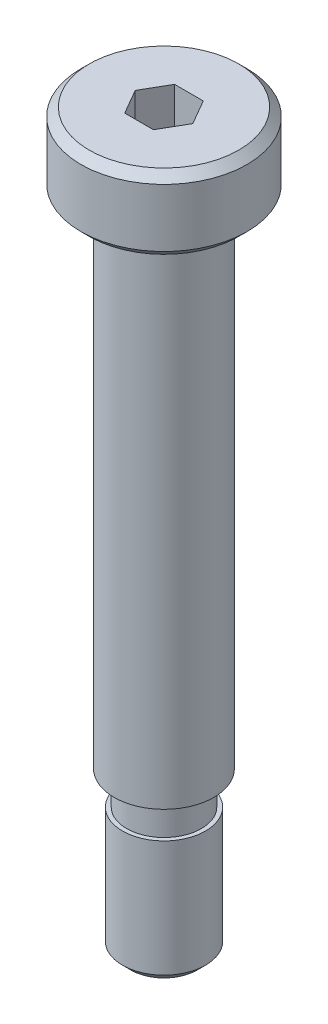
ISO-10303-21;
HEADER;
FILE_DESCRIPTION(('STEP AP214'),'2;1');
FILE_NAME('part.step','',(''),(''),'','','');
FILE_SCHEMA(('AUTOMOTIVE_DESIGN { 1 0 10303 214 1 1 1 1 }'));
ENDSEC;
DATA;
#1=APPLICATION_CONTEXT('core data for automotive mechanical design processes');
#2=APPLICATION_PROTOCOL_DEFINITION('international standard','automotive_design',2000,#1);
#3=PRODUCT_CONTEXT('',#1,'mechanical');
#4=PRODUCT('Part','Part','',(#3));
#5=PRODUCT_RELATED_PRODUCT_CATEGORY('part','',(#4));
#6=PRODUCT_DEFINITION_FORMATION('','',#4);
#7=PRODUCT_DEFINITION_CONTEXT('part definition',#1,'design');
#8=PRODUCT_DEFINITION('design','',#6,#7);
#9=PRODUCT_DEFINITION_SHAPE('','',#8);
#10=(LENGTH_UNIT() NAMED_UNIT(*) SI_UNIT(.MILLI.,.METRE.));
#11=(NAMED_UNIT(*) PLANE_ANGLE_UNIT() SI_UNIT($,.RADIAN.));
#12=(NAMED_UNIT(*) SI_UNIT($,.STERADIAN.) SOLID_ANGLE_UNIT());
#13=UNCERTAINTY_MEASURE_WITH_UNIT(LENGTH_MEASURE(1.E-05),#10,'distance_accuracy_value','');
#14=(GEOMETRIC_REPRESENTATION_CONTEXT(3) GLOBAL_UNCERTAINTY_ASSIGNED_CONTEXT((#13)) GLOBAL_UNIT_ASSIGNED_CONTEXT((#10,
#11,#12)) REPRESENTATION_CONTEXT('',''));
#15=CARTESIAN_POINT('',(0.,0.,0.));
#16=DIRECTION('',(0.,0.,1.));
#17=DIRECTION('',(1.,0.,0.));
#18=AXIS2_PLACEMENT_3D('',#15,#16,#17);
#19=CARTESIAN_POINT('',(0.,0.,0.));
#20=DIRECTION('',(0.,-1.,0.));
#21=DIRECTION('',(1.,0.,0.));
#22=AXIS2_PLACEMENT_3D('',#19,#20,#21);
#23=PLANE('',#22);
#24=DIRECTION('',(-0.5,0.,-0.866025403784438));
#25=VECTOR('',#24,1.);
#26=CARTESIAN_POINT('',(1.73205080756888,0.,0.));
#27=LINE('',#26,#25);
#28=CARTESIAN_POINT('',(1.73205080756888,0.,0.));
#29=VERTEX_POINT('',#28);
#30=CARTESIAN_POINT('',(0.866025403784439,0.,-1.5));
#31=VERTEX_POINT('',#30);
#32=EDGE_CURVE('E140',#29,#31,#27,.T.);
#33=ORIENTED_EDGE('',*,*,#32,.F.);
#34=DIRECTION('',(0.5,0.,-0.866025403784439));
#35=VECTOR('',#34,1.);
#36=CARTESIAN_POINT('',(0.866025403784439,0.,1.5));
#37=LINE('',#36,#35);
#38=CARTESIAN_POINT('',(0.866025403784439,0.,1.5));
#39=VERTEX_POINT('',#38);
#40=EDGE_CURVE('E66',#39,#29,#37,.T.);
#41=ORIENTED_EDGE('',*,*,#40,.F.);
#42=DIRECTION('',(1.,0.,0.));
#43=VECTOR('',#42,1.);
#44=CARTESIAN_POINT('',(-0.866025403784439,0.,1.5));
#45=LINE('',#44,#43);
#46=CARTESIAN_POINT('',(-0.866025403784439,0.,1.5));
#47=VERTEX_POINT('',#46);
#48=EDGE_CURVE('E149',#47,#39,#45,.T.);
#49=ORIENTED_EDGE('',*,*,#48,.F.);
#50=DIRECTION('',(0.5,0.,0.866025403784439));
#51=VECTOR('',#50,1.);
#52=CARTESIAN_POINT('',(-1.73205080756888,0.,0.));
#53=LINE('',#52,#51);
#54=CARTESIAN_POINT('',(-1.73205080756888,0.,0.));
#55=VERTEX_POINT('',#54);
#56=EDGE_CURVE('E147',#55,#47,#53,.T.);
#57=ORIENTED_EDGE('',*,*,#56,.F.);
#58=DIRECTION('',(-0.5,0.,0.866025403784439));
#59=VECTOR('',#58,1.);
#60=CARTESIAN_POINT('',(-0.86602540378444,0.,-1.5));
#61=LINE('',#60,#59);
#62=CARTESIAN_POINT('',(-0.86602540378444,0.,-1.5));
#63=VERTEX_POINT('',#62);
#64=EDGE_CURVE('E114',#63,#55,#61,.T.);
#65=ORIENTED_EDGE('',*,*,#64,.F.);
#66=DIRECTION('',(-1.,0.,0.));
#67=VECTOR('',#66,1.);
#68=CARTESIAN_POINT('',(0.866025403784439,0.,-1.5));
#69=LINE('',#68,#67);
#70=EDGE_CURVE('E143',#31,#63,#69,.T.);
#71=ORIENTED_EDGE('',*,*,#70,.F.);
#72=EDGE_LOOP('',(#33,#41,#49,#57,#65,#71));
#73=FACE_BOUND('',#72,.T.);
#74=CARTESIAN_POINT('',(0.,0.,0.));
#75=DIRECTION('',(0.,-1.,0.));
#76=DIRECTION('',(1.,0.,0.));
#77=AXIS2_PLACEMENT_3D('',#74,#75,#76);
#78=CIRCLE('',#77,4.5);
#79=CARTESIAN_POINT('',(4.5,0.,0.));
#80=VERTEX_POINT('',#79);
#81=EDGE_CURVE('E11',#80,#80,#78,.F.);
#82=ORIENTED_EDGE('',*,*,#81,.T.);
#83=EDGE_LOOP('',(#82));
#84=FACE_BOUND('',#83,.T.);
#85=ADVANCED_FACE('F50',(#73,#84),#23,.F.);
#86=CARTESIAN_POINT('',(0.,3.,0.));
#87=DIRECTION('',(0.,1.,0.));
#88=DIRECTION('',(-1.,0.,0.));
#89=AXIS2_PLACEMENT_3D('',#86,#87,#88);
#90=CYLINDRICAL_SURFACE('',#89,5.);
#91=CARTESIAN_POINT('',(0.,-4.00000000000001,0.));
#92=DIRECTION('',(0.,1.,0.));
#93=DIRECTION('',(-1.,0.,0.));
#94=AXIS2_PLACEMENT_3D('',#91,#92,#93);
#95=CIRCLE('',#94,5.);
#96=CARTESIAN_POINT('',(-5.,-4.00000000000001,0.));
#97=VERTEX_POINT('',#96);
#98=EDGE_CURVE('E188',#97,#97,#95,.T.);
#99=ORIENTED_EDGE('',*,*,#98,.T.);
#100=EDGE_LOOP('',(#99));
#101=FACE_BOUND('',#100,.T.);
#102=CARTESIAN_POINT('',(0.,-0.500000000000008,0.));
#103=DIRECTION('',(0.,-1.,0.));
#104=DIRECTION('',(1.,0.,0.));
#105=AXIS2_PLACEMENT_3D('',#102,#103,#104);
#106=CIRCLE('',#105,5.);
#107=CARTESIAN_POINT('',(5.,-0.500000000000007,0.));
#108=VERTEX_POINT('',#107);
#109=EDGE_CURVE('E185',#108,#108,#106,.T.);
#110=ORIENTED_EDGE('',*,*,#109,.T.);
#111=EDGE_LOOP('',(#110));
#112=FACE_BOUND('',#111,.T.);
#113=ADVANCED_FACE('F202',(#101,#112),#90,.T.);
#114=CARTESIAN_POINT('',(5.,-4.5,0.));
#115=DIRECTION('',(0.,1.,0.));
#116=DIRECTION('',(-1.,0.,0.));
#117=AXIS2_PLACEMENT_3D('',#114,#115,#116);
#118=PLANE('',#117);
#119=CARTESIAN_POINT('',(0.,-4.5,0.));
#120=DIRECTION('',(0.,1.,0.));
#121=DIRECTION('',(-1.,0.,0.));
#122=AXIS2_PLACEMENT_3D('',#119,#120,#121);
#123=CIRCLE('',#122,4.50000000000001);
#124=CARTESIAN_POINT('',(-4.50000000000001,-4.5,0.));
#125=VERTEX_POINT('',#124);
#126=EDGE_CURVE('E59',#125,#125,#123,.F.);
#127=ORIENTED_EDGE('',*,*,#126,.T.);
#128=EDGE_LOOP('',(#127));
#129=FACE_BOUND('',#128,.T.);
#130=CARTESIAN_POINT('',(0.,-4.5,0.));
#131=DIRECTION('',(0.,1.,0.));
#132=DIRECTION('',(-1.,0.,0.));
#133=AXIS2_PLACEMENT_3D('',#130,#131,#132);
#134=CIRCLE('',#133,2.75);
#135=CARTESIAN_POINT('',(-2.75,-4.5,0.));
#136=VERTEX_POINT('',#135);
#137=EDGE_CURVE('E176',#136,#136,#134,.T.);
#138=ORIENTED_EDGE('',*,*,#137,.T.);
#139=EDGE_LOOP('',(#138));
#140=FACE_BOUND('',#139,.T.);
#141=ADVANCED_FACE('F193',(#129,#140),#118,.F.);
#142=CARTESIAN_POINT('',(0.,3.,0.));
#143=DIRECTION('',(0.,1.,0.));
#144=DIRECTION('',(-1.,0.,0.));
#145=AXIS2_PLACEMENT_3D('',#142,#143,#144);
#146=CYLINDRICAL_SURFACE('',#145,2.75);
#147=ORIENTED_EDGE('',*,*,#137,.F.);
#148=EDGE_LOOP('',(#147));
#149=FACE_BOUND('',#148,.T.);
#150=CARTESIAN_POINT('',(0.,-5.,0.));
#151=DIRECTION('',(0.,1.,0.));
#152=DIRECTION('',(-1.,0.,0.));
#153=AXIS2_PLACEMENT_3D('',#150,#151,#152);
#154=CIRCLE('',#153,2.75);
#155=CARTESIAN_POINT('',(-2.75,-5.,0.));
#156=VERTEX_POINT('',#155);
#157=EDGE_CURVE('E173',#156,#156,#154,.T.);
#158=ORIENTED_EDGE('',*,*,#157,.T.);
#159=EDGE_LOOP('',(#158));
#160=FACE_BOUND('',#159,.T.);
#161=ADVANCED_FACE('F273',(#149,#160),#146,.T.);
#162=CARTESIAN_POINT('',(2.75,-5.,0.));
#163=DIRECTION('',(0.,-1.,0.));
#164=DIRECTION('',(1.,0.,0.));
#165=AXIS2_PLACEMENT_3D('',#162,#163,#164);
#166=PLANE('',#165);
#167=ORIENTED_EDGE('',*,*,#157,.F.);
#168=EDGE_LOOP('',(#167));
#169=FACE_BOUND('',#168,.T.);
#170=CARTESIAN_POINT('',(0.,-5.,0.));
#171=DIRECTION('',(0.,1.,0.));
#172=DIRECTION('',(-1.,0.,0.));
#173=AXIS2_PLACEMENT_3D('',#170,#171,#172);
#174=CIRCLE('',#173,3.);
#175=CARTESIAN_POINT('',(-3.,-5.,0.));
#176=VERTEX_POINT('',#175);
#177=EDGE_CURVE('E170',#176,#176,#174,.T.);
#178=ORIENTED_EDGE('',*,*,#177,.T.);
#179=EDGE_LOOP('',(#178));
#180=FACE_BOUND('',#179,.T.);
#181=ADVANCED_FACE('F269',(#169,#180),#166,.F.);
#182=CARTESIAN_POINT('',(0.,3.,0.));
#183=DIRECTION('',(0.,1.,0.));
#184=DIRECTION('',(-1.,0.,0.));
#185=AXIS2_PLACEMENT_3D('',#182,#183,#184);
#186=CYLINDRICAL_SURFACE('',#185,3.);
#187=ORIENTED_EDGE('',*,*,#177,.F.);
#188=EDGE_LOOP('',(#187));
#189=FACE_BOUND('',#188,.T.);
#190=CARTESIAN_POINT('',(0.,-34.5,0.));
#191=DIRECTION('',(0.,1.,0.));
#192=DIRECTION('',(-1.,0.,0.));
#193=AXIS2_PLACEMENT_3D('',#190,#191,#192);
#194=CIRCLE('',#193,3.00000000000001);
#195=CARTESIAN_POINT('',(-3.,-34.5,0.));
#196=VERTEX_POINT('',#195);
#197=EDGE_CURVE('E167',#196,#196,#194,.T.);
#198=ORIENTED_EDGE('',*,*,#197,.T.);
#199=EDGE_LOOP('',(#198));
#200=FACE_BOUND('',#199,.T.);
#201=ADVANCED_FACE('F265',(#189,#200),#186,.T.);
#202=CARTESIAN_POINT('',(3.00000000000001,-34.5,0.));
#203=DIRECTION('',(0.,1.,0.));
#204=DIRECTION('',(-1.,0.,0.));
#205=AXIS2_PLACEMENT_3D('',#202,#203,#204);
#206=PLANE('',#205);
#207=ORIENTED_EDGE('',*,*,#197,.F.);
#208=EDGE_LOOP('',(#207));
#209=FACE_BOUND('',#208,.T.);
#210=CARTESIAN_POINT('',(0.,-34.5,0.));
#211=DIRECTION('',(0.,1.,0.));
#212=DIRECTION('',(-1.,0.,0.));
#213=AXIS2_PLACEMENT_3D('',#210,#211,#212);
#214=CIRCLE('',#213,2.25);
#215=CARTESIAN_POINT('',(-2.25,-34.5,0.));
#216=VERTEX_POINT('',#215);
#217=EDGE_CURVE('E164',#216,#216,#214,.T.);
#218=ORIENTED_EDGE('',*,*,#217,.T.);
#219=EDGE_LOOP('',(#218));
#220=FACE_BOUND('',#219,.T.);
#221=ADVANCED_FACE('F258',(#209,#220),#206,.F.);
#222=CARTESIAN_POINT('',(0.,3.,0.));
#223=DIRECTION('',(0.,1.,0.));
#224=DIRECTION('',(-1.,0.,0.));
#225=AXIS2_PLACEMENT_3D('',#222,#223,#224);
#226=CYLINDRICAL_SURFACE('',#225,2.25);
#227=ORIENTED_EDGE('',*,*,#217,.F.);
#228=EDGE_LOOP('',(#227));
#229=FACE_BOUND('',#228,.T.);
#230=CARTESIAN_POINT('',(0.,-36.5,0.));
#231=DIRECTION('',(0.,1.,0.));
#232=DIRECTION('',(-1.,0.,0.));
#233=AXIS2_PLACEMENT_3D('',#230,#231,#232);
#234=CIRCLE('',#233,2.25);
#235=CARTESIAN_POINT('',(-2.25,-36.5,0.));
#236=VERTEX_POINT('',#235);
#237=EDGE_CURVE('E161',#236,#236,#234,.T.);
#238=ORIENTED_EDGE('',*,*,#237,.T.);
#239=EDGE_LOOP('',(#238));
#240=FACE_BOUND('',#239,.T.);
#241=ADVANCED_FACE('F252',(#229,#240),#226,.T.);
#242=CARTESIAN_POINT('',(2.5,-36.5,0.));
#243=DIRECTION('',(0.,-1.,0.));
#244=DIRECTION('',(1.,0.,0.));
#245=AXIS2_PLACEMENT_3D('',#242,#243,#244);
#246=PLANE('',#245);
#247=ORIENTED_EDGE('',*,*,#237,.F.);
#248=EDGE_LOOP('',(#247));
#249=FACE_BOUND('',#248,.T.);
#250=CARTESIAN_POINT('',(0.,-36.5,0.));
#251=DIRECTION('',(0.,1.,0.));
#252=DIRECTION('',(-1.,0.,0.));
#253=AXIS2_PLACEMENT_3D('',#250,#251,#252);
#254=CIRCLE('',#253,2.5);
#255=CARTESIAN_POINT('',(-2.5,-36.5,0.));
#256=VERTEX_POINT('',#255);
#257=EDGE_CURVE('E153',#256,#256,#254,.T.);
#258=ORIENTED_EDGE('',*,*,#257,.T.);
#259=EDGE_LOOP('',(#258));
#260=FACE_BOUND('',#259,.T.);
#261=ADVANCED_FACE('F247',(#249,#260),#246,.F.);
#262=CARTESIAN_POINT('',(0.,3.,0.));
#263=DIRECTION('',(0.,1.,0.));
#264=DIRECTION('',(-1.,0.,0.));
#265=AXIS2_PLACEMENT_3D('',#262,#263,#264);
#266=CYLINDRICAL_SURFACE('',#265,2.5);
#267=CARTESIAN_POINT('',(0.,-43.5,0.));
#268=DIRECTION('',(0.,1.,0.));
#269=DIRECTION('',(-1.,0.,0.));
#270=AXIS2_PLACEMENT_3D('',#267,#268,#269);
#271=CIRCLE('',#270,2.5);
#272=CARTESIAN_POINT('',(-2.49999999999999,-43.5,0.));
#273=VERTEX_POINT('',#272);
#274=EDGE_CURVE('E179',#273,#273,#271,.T.);
#275=ORIENTED_EDGE('',*,*,#274,.T.);
#276=EDGE_LOOP('',(#275));
#277=FACE_BOUND('',#276,.T.);
#278=ORIENTED_EDGE('',*,*,#257,.F.);
#279=EDGE_LOOP('',(#278));
#280=FACE_BOUND('',#279,.T.);
#281=ADVANCED_FACE('F238',(#277,#280),#266,.T.);
#282=CARTESIAN_POINT('',(2.50000000000001,-44.,0.));
#283=DIRECTION('',(0.,1.,0.));
#284=DIRECTION('',(-1.,0.,0.));
#285=AXIS2_PLACEMENT_3D('',#282,#283,#284);
#286=PLANE('',#285);
#287=CARTESIAN_POINT('',(0.,-44.,0.));
#288=DIRECTION('',(0.,1.,0.));
#289=DIRECTION('',(-1.,0.,0.));
#290=AXIS2_PLACEMENT_3D('',#287,#288,#289);
#291=CIRCLE('',#290,1.99999999999998);
#292=CARTESIAN_POINT('',(-1.99999999999997,-44.,0.));
#293=VERTEX_POINT('',#292);
#294=EDGE_CURVE('E182',#293,#293,#291,.F.);
#295=ORIENTED_EDGE('',*,*,#294,.T.);
#296=EDGE_LOOP('',(#295));
#297=FACE_BOUND('',#296,.T.);
#298=ADVANCED_FACE('F227',(#297),#286,.F.);
#299=CARTESIAN_POINT('',(0.,-43.5,0.));
#300=DIRECTION('',(0.,1.,0.));
#301=DIRECTION('',(-1.,0.,0.));
#302=AXIS2_PLACEMENT_3D('',#299,#300,#301);
#303=CONICAL_SURFACE('',#302,2.5,0.785398163397447);
#304=ORIENTED_EDGE('',*,*,#294,.F.);
#305=EDGE_LOOP('',(#304));
#306=FACE_BOUND('',#305,.T.);
#307=ORIENTED_EDGE('',*,*,#274,.F.);
#308=EDGE_LOOP('',(#307));
#309=FACE_BOUND('',#308,.T.);
#310=ADVANCED_FACE('F199',(#306,#309),#303,.T.);
#311=CARTESIAN_POINT('',(0.,-4.00000000000001,0.));
#312=DIRECTION('',(0.,1.,0.));
#313=DIRECTION('',(-1.,0.,0.));
#314=AXIS2_PLACEMENT_3D('',#311,#312,#313);
#315=CONICAL_SURFACE('',#314,5.,0.785398163397448);
#316=ORIENTED_EDGE('',*,*,#126,.F.);
#317=EDGE_LOOP('',(#316));
#318=FACE_BOUND('',#317,.T.);
#319=ORIENTED_EDGE('',*,*,#98,.F.);
#320=EDGE_LOOP('',(#319));
#321=FACE_BOUND('',#320,.T.);
#322=ADVANCED_FACE('F196',(#318,#321),#315,.T.);
#323=CARTESIAN_POINT('',(0.,0.,0.));
#324=DIRECTION('',(0.,-1.,0.));
#325=DIRECTION('',(1.,0.,0.));
#326=AXIS2_PLACEMENT_3D('',#323,#324,#325);
#327=CONICAL_SURFACE('',#326,4.5,0.785398163397445);
#328=ORIENTED_EDGE('',*,*,#109,.F.);
#329=EDGE_LOOP('',(#328));
#330=FACE_BOUND('',#329,.T.);
#331=ORIENTED_EDGE('',*,*,#81,.F.);
#332=EDGE_LOOP('',(#331));
#333=FACE_BOUND('',#332,.T.);
#334=ADVANCED_FACE('F53',(#330,#333),#327,.T.);
#335=CARTESIAN_POINT('',(0.866025403784439,-3.,1.5));
#336=DIRECTION('',(0.866025403784439,0.,0.5));
#337=DIRECTION('',(0.5,0.,-0.866025403784439));
#338=AXIS2_PLACEMENT_3D('',#335,#336,#337);
#339=PLANE('',#338);
#340=ORIENTED_EDGE('',*,*,#40,.T.);
#341=DIRECTION('',(0.,1.,0.));
#342=VECTOR('',#341,1.);
#343=CARTESIAN_POINT('',(1.73205080756888,-3.,0.));
#344=LINE('',#343,#342);
#345=CARTESIAN_POINT('',(1.73205080756888,-3.,0.));
#346=VERTEX_POINT('',#345);
#347=EDGE_CURVE('E96',#346,#29,#344,.T.);
#348=ORIENTED_EDGE('',*,*,#347,.F.);
#349=DIRECTION('',(0.5,0.,-0.866025403784439));
#350=VECTOR('',#349,1.);
#351=CARTESIAN_POINT('',(0.866025403784439,-3.,1.5));
#352=LINE('',#351,#350);
#353=CARTESIAN_POINT('',(0.866025403784439,-3.,1.5));
#354=VERTEX_POINT('',#353);
#355=EDGE_CURVE('E151',#354,#346,#352,.T.);
#356=ORIENTED_EDGE('',*,*,#355,.F.);
#357=DIRECTION('',(0.,1.,0.));
#358=VECTOR('',#357,1.);
#359=CARTESIAN_POINT('',(0.866025403784439,-3.,1.5));
#360=LINE('',#359,#358);
#361=EDGE_CURVE('E74',#354,#39,#360,.T.);
#362=ORIENTED_EDGE('',*,*,#361,.T.);
#363=EDGE_LOOP('',(#340,#348,#356,#362));
#364=FACE_BOUND('',#363,.T.);
#365=ADVANCED_FACE('F210',(#364),#339,.F.);
#366=CARTESIAN_POINT('',(-0.866025403784439,-3.,1.5));
#367=DIRECTION('',(0.,0.,1.));
#368=DIRECTION('',(1.,0.,0.));
#369=AXIS2_PLACEMENT_3D('',#366,#367,#368);
#370=PLANE('',#369);
#371=ORIENTED_EDGE('',*,*,#48,.T.);
#372=ORIENTED_EDGE('',*,*,#361,.F.);
#373=DIRECTION('',(1.,0.,0.));
#374=VECTOR('',#373,1.);
#375=CARTESIAN_POINT('',(-0.866025403784439,-3.,1.5));
#376=LINE('',#375,#374);
#377=CARTESIAN_POINT('',(-0.866025403784439,-3.,1.5));
#378=VERTEX_POINT('',#377);
#379=EDGE_CURVE('E126',#378,#354,#376,.T.);
#380=ORIENTED_EDGE('',*,*,#379,.F.);
#381=DIRECTION('',(0.,1.,0.));
#382=VECTOR('',#381,1.);
#383=CARTESIAN_POINT('',(-0.866025403784439,-3.,1.5));
#384=LINE('',#383,#382);
#385=EDGE_CURVE('E118',#378,#47,#384,.T.);
#386=ORIENTED_EDGE('',*,*,#385,.T.);
#387=EDGE_LOOP('',(#371,#372,#380,#386));
#388=FACE_BOUND('',#387,.T.);
#389=ADVANCED_FACE('F320',(#388),#370,.F.);
#390=CARTESIAN_POINT('',(-1.73205080756888,-3.,0.));
#391=DIRECTION('',(-0.866025403784439,0.,0.5));
#392=DIRECTION('',(0.5,0.,0.866025403784439));
#393=AXIS2_PLACEMENT_3D('',#390,#391,#392);
#394=PLANE('',#393);
#395=ORIENTED_EDGE('',*,*,#56,.T.);
#396=ORIENTED_EDGE('',*,*,#385,.F.);
#397=DIRECTION('',(0.5,0.,0.866025403784439));
#398=VECTOR('',#397,1.);
#399=CARTESIAN_POINT('',(-1.73205080756888,-3.,0.));
#400=LINE('',#399,#398);
#401=CARTESIAN_POINT('',(-1.73205080756888,-3.,0.));
#402=VERTEX_POINT('',#401);
#403=EDGE_CURVE('E122',#402,#378,#400,.T.);
#404=ORIENTED_EDGE('',*,*,#403,.F.);
#405=DIRECTION('',(0.,1.,0.));
#406=VECTOR('',#405,1.);
#407=CARTESIAN_POINT('',(-1.73205080756888,-3.,0.));
#408=LINE('',#407,#406);
#409=EDGE_CURVE('E107',#402,#55,#408,.T.);
#410=ORIENTED_EDGE('',*,*,#409,.T.);
#411=EDGE_LOOP('',(#395,#396,#404,#410));
#412=FACE_BOUND('',#411,.T.);
#413=ADVANCED_FACE('F123',(#412),#394,.F.);
#414=CARTESIAN_POINT('',(-0.86602540378444,-3.,-1.5));
#415=DIRECTION('',(-0.866025403784439,0.,-0.5));
#416=DIRECTION('',(-0.5,0.,0.866025403784439));
#417=AXIS2_PLACEMENT_3D('',#414,#415,#416);
#418=PLANE('',#417);
#419=ORIENTED_EDGE('',*,*,#64,.T.);
#420=ORIENTED_EDGE('',*,*,#409,.F.);
#421=DIRECTION('',(-0.5,0.,0.866025403784439));
#422=VECTOR('',#421,1.);
#423=CARTESIAN_POINT('',(-0.86602540378444,-3.,-1.5));
#424=LINE('',#423,#422);
#425=CARTESIAN_POINT('',(-0.86602540378444,-3.,-1.5));
#426=VERTEX_POINT('',#425);
#427=EDGE_CURVE('E111',#426,#402,#424,.T.);
#428=ORIENTED_EDGE('',*,*,#427,.F.);
#429=DIRECTION('',(0.,1.,0.));
#430=VECTOR('',#429,1.);
#431=CARTESIAN_POINT('',(-0.86602540378444,-3.,-1.5));
#432=LINE('',#431,#430);
#433=EDGE_CURVE('E119',#426,#63,#432,.T.);
#434=ORIENTED_EDGE('',*,*,#433,.T.);
#435=EDGE_LOOP('',(#419,#420,#428,#434));
#436=FACE_BOUND('',#435,.T.);
#437=ADVANCED_FACE('F109',(#436),#418,.F.);
#438=CARTESIAN_POINT('',(0.866025403784439,-3.,-1.5));
#439=DIRECTION('',(0.,0.,-1.));
#440=DIRECTION('',(-1.,0.,0.));
#441=AXIS2_PLACEMENT_3D('',#438,#439,#440);
#442=PLANE('',#441);
#443=ORIENTED_EDGE('',*,*,#70,.T.);
#444=ORIENTED_EDGE('',*,*,#433,.F.);
#445=DIRECTION('',(-1.,0.,0.));
#446=VECTOR('',#445,1.);
#447=CARTESIAN_POINT('',(0.866025403784439,-3.,-1.5));
#448=LINE('',#447,#446);
#449=CARTESIAN_POINT('',(0.866025403784439,-3.,-1.5));
#450=VERTEX_POINT('',#449);
#451=EDGE_CURVE('E132',#450,#426,#448,.T.);
#452=ORIENTED_EDGE('',*,*,#451,.F.);
#453=DIRECTION('',(0.,1.,0.));
#454=VECTOR('',#453,1.);
#455=CARTESIAN_POINT('',(0.866025403784439,-3.,-1.5));
#456=LINE('',#455,#454);
#457=EDGE_CURVE('E156',#450,#31,#456,.T.);
#458=ORIENTED_EDGE('',*,*,#457,.T.);
#459=EDGE_LOOP('',(#443,#444,#452,#458));
#460=FACE_BOUND('',#459,.T.);
#461=ADVANCED_FACE('F345',(#460),#442,.F.);
#462=CARTESIAN_POINT('',(1.73205080756888,-3.,0.));
#463=DIRECTION('',(0.866025403784438,0.,-0.5));
#464=DIRECTION('',(-0.5,0.,-0.866025403784438));
#465=AXIS2_PLACEMENT_3D('',#462,#463,#464);
#466=PLANE('',#465);
#467=ORIENTED_EDGE('',*,*,#32,.T.);
#468=ORIENTED_EDGE('',*,*,#457,.F.);
#469=DIRECTION('',(-0.5,0.,-0.866025403784438));
#470=VECTOR('',#469,1.);
#471=CARTESIAN_POINT('',(1.73205080756888,-3.,0.));
#472=LINE('',#471,#470);
#473=EDGE_CURVE('E134',#346,#450,#472,.T.);
#474=ORIENTED_EDGE('',*,*,#473,.F.);
#475=ORIENTED_EDGE('',*,*,#347,.T.);
#476=EDGE_LOOP('',(#467,#468,#474,#475));
#477=FACE_BOUND('',#476,.T.);
#478=ADVANCED_FACE('F354',(#477),#466,.F.);
#479=CARTESIAN_POINT('',(0.,-3.,0.));
#480=DIRECTION('',(0.,1.,0.));
#481=DIRECTION('',(0.,0.,1.));
#482=AXIS2_PLACEMENT_3D('',#479,#480,#481);
#483=PLANE('',#482);
#484=ORIENTED_EDGE('',*,*,#355,.T.);
#485=ORIENTED_EDGE('',*,*,#473,.T.);
#486=ORIENTED_EDGE('',*,*,#451,.T.);
#487=ORIENTED_EDGE('',*,*,#427,.T.);
#488=ORIENTED_EDGE('',*,*,#403,.T.);
#489=ORIENTED_EDGE('',*,*,#379,.T.);
#490=EDGE_LOOP('',(#484,#485,#486,#487,#488,#489));
#491=FACE_BOUND('',#490,.T.);
#492=ADVANCED_FACE('F129',(#491),#483,.T.);
#493=CLOSED_SHELL('',(#85,#113,#141,#161,#181,#201,#221,#241,#261,#281,#298,#310,#322,#334,#365,
#389,#413,#437,#461,#478,#492));
#494=MANIFOLD_SOLID_BREP('B2',#493);
#495=ADVANCED_BREP_SHAPE_REPRESENTATION('',(#18,#494),#14);
#496=SHAPE_DEFINITION_REPRESENTATION(#9,#495);
ENDSEC;
END-ISO-10303-21;
